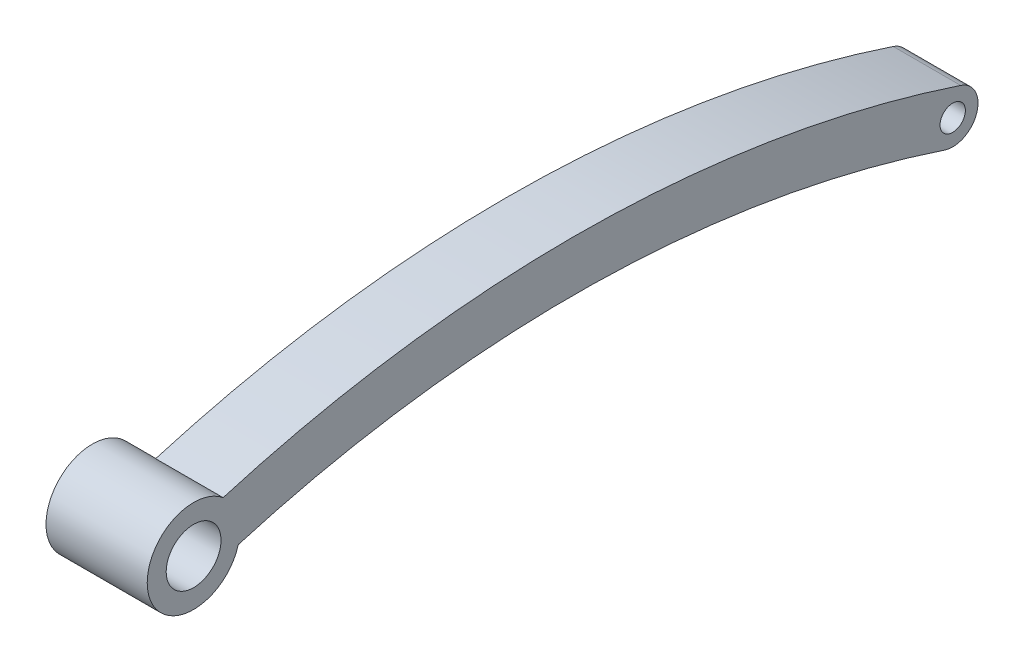
ISO-10303-21;
HEADER;
FILE_DESCRIPTION(('STEP AP214'),'2;1');
FILE_NAME('part.step','',(''),(''),'','','');
FILE_SCHEMA(('AUTOMOTIVE_DESIGN { 1 0 10303 214 1 1 1 1 }'));
ENDSEC;
DATA;
#1=APPLICATION_CONTEXT('core data for automotive mechanical design processes');
#2=APPLICATION_PROTOCOL_DEFINITION('international standard','automotive_design',2000,#1);
#3=PRODUCT_CONTEXT('',#1,'mechanical');
#4=PRODUCT('Part','Part','',(#3));
#5=PRODUCT_RELATED_PRODUCT_CATEGORY('part','',(#4));
#6=PRODUCT_DEFINITION_FORMATION('','',#4);
#7=PRODUCT_DEFINITION_CONTEXT('part definition',#1,'design');
#8=PRODUCT_DEFINITION('design','',#6,#7);
#9=PRODUCT_DEFINITION_SHAPE('','',#8);
#10=(LENGTH_UNIT() NAMED_UNIT(*) SI_UNIT(.MILLI.,.METRE.));
#11=(NAMED_UNIT(*) PLANE_ANGLE_UNIT() SI_UNIT($,.RADIAN.));
#12=(NAMED_UNIT(*) SI_UNIT($,.STERADIAN.) SOLID_ANGLE_UNIT());
#13=UNCERTAINTY_MEASURE_WITH_UNIT(LENGTH_MEASURE(1.E-05),#10,'distance_accuracy_value','');
#14=(GEOMETRIC_REPRESENTATION_CONTEXT(3) GLOBAL_UNCERTAINTY_ASSIGNED_CONTEXT((#13)) GLOBAL_UNIT_ASSIGNED_CONTEXT((#10,
#11,#12)) REPRESENTATION_CONTEXT('',''));
#15=CARTESIAN_POINT('',(0.,0.,0.));
#16=DIRECTION('',(0.,0.,1.));
#17=DIRECTION('',(1.,0.,0.));
#18=AXIS2_PLACEMENT_3D('',#15,#16,#17);
#19=CARTESIAN_POINT('',(4.,-33.9337590019143,-33.75));
#20=DIRECTION('',(-1.,0.,0.));
#21=DIRECTION('',(0.,0.,1.));
#22=AXIS2_PLACEMENT_3D('',#19,#20,#21);
#23=PLANE('',#22);
#24=CARTESIAN_POINT('',(4.,0.,0.));
#25=DIRECTION('',(-1.,0.,0.));
#26=DIRECTION('',(0.,0.,1.));
#27=AXIS2_PLACEMENT_3D('',#24,#25,#26);
#28=CIRCLE('',#27,1.625);
#29=CARTESIAN_POINT('',(4.,0.,1.625));
#30=VERTEX_POINT('',#29);
#31=EDGE_CURVE('E113',#30,#30,#28,.T.);
#32=ORIENTED_EDGE('',*,*,#31,.T.);
#33=EDGE_LOOP('',(#32));
#34=FACE_BOUND('',#33,.T.);
#35=CARTESIAN_POINT('',(4.,-67.8675180038286,-22.5));
#36=DIRECTION('',(1.,0.,0.));
#37=DIRECTION('',(0.,0.,1.));
#38=AXIS2_PLACEMENT_3D('',#35,#36,#37);
#39=CIRCLE('',#38,73.);
#40=CARTESIAN_POINT('',(4.,1.42379408399641,-45.472027972028));
#41=VERTEX_POINT('',#40);
#42=CARTESIAN_POINT('',(4.,2.12132037920733,-1.74999995678847));
#43=VERTEX_POINT('',#42);
#44=EDGE_CURVE('E129',#41,#43,#39,.T.);
#45=ORIENTED_EDGE('',*,*,#44,.T.);
#46=CARTESIAN_POINT('',(4.,0.,0.));
#47=DIRECTION('',(-1.,0.,0.));
#48=DIRECTION('',(0.,0.,1.));
#49=AXIS2_PLACEMENT_3D('',#46,#47,#48);
#50=CIRCLE('',#49,2.75);
#51=CARTESIAN_POINT('',(4.,-0.74148697723711,-2.64814974323352));
#52=VERTEX_POINT('',#51);
#53=EDGE_CURVE('E89',#52,#43,#50,.T.);
#54=ORIENTED_EDGE('',*,*,#53,.F.);
#55=CARTESIAN_POINT('',(4.,-67.8675180038286,-22.5));
#56=DIRECTION('',(-1.,0.,0.));
#57=DIRECTION('',(0.,0.,1.));
#58=AXIS2_PLACEMENT_3D('',#55,#56,#57);
#59=CIRCLE('',#58,70.);
#60=CARTESIAN_POINT('',(4.,-1.42379408399639,-44.527972027972));
#61=VERTEX_POINT('',#60);
#62=EDGE_CURVE('E64',#52,#61,#59,.T.);
#63=ORIENTED_EDGE('',*,*,#62,.T.);
#64=CARTESIAN_POINT('',(4.,0.,-45.));
#65=DIRECTION('',(1.,0.,0.));
#66=DIRECTION('',(0.,0.,-1.));
#67=AXIS2_PLACEMENT_3D('',#64,#65,#66);
#68=CIRCLE('',#67,1.5);
#69=EDGE_CURVE('E135',#61,#41,#68,.T.);
#70=ORIENTED_EDGE('',*,*,#69,.T.);
#71=EDGE_LOOP('',(#45,#54,#63,#70));
#72=FACE_BOUND('',#71,.T.);
#73=CARTESIAN_POINT('',(4.,0.,-45.));
#74=DIRECTION('',(1.,0.,0.));
#75=DIRECTION('',(0.,0.,-1.));
#76=AXIS2_PLACEMENT_3D('',#73,#74,#75);
#77=CIRCLE('',#76,0.749999999999999);
#78=CARTESIAN_POINT('',(4.,0.,-45.75));
#79=VERTEX_POINT('',#78);
#80=EDGE_CURVE('E102',#79,#79,#77,.T.);
#81=ORIENTED_EDGE('',*,*,#80,.F.);
#82=EDGE_LOOP('',(#81));
#83=FACE_BOUND('',#82,.T.);
#84=ADVANCED_FACE('F41',(#34,#72,#83),#23,.F.);
#85=CARTESIAN_POINT('',(0.,-33.9337590019143,-33.75));
#86=DIRECTION('',(-1.,0.,0.));
#87=DIRECTION('',(0.,0.,1.));
#88=AXIS2_PLACEMENT_3D('',#85,#86,#87);
#89=PLANE('',#88);
#90=CARTESIAN_POINT('',(0.,0.,0.));
#91=DIRECTION('',(-1.,0.,0.));
#92=DIRECTION('',(0.,0.,1.));
#93=AXIS2_PLACEMENT_3D('',#90,#91,#92);
#94=CIRCLE('',#93,2.75);
#95=CARTESIAN_POINT('',(0.,2.12132037920733,-1.74999995678847));
#96=VERTEX_POINT('',#95);
#97=CARTESIAN_POINT('',(0.,-0.741486977237108,-2.64814974323352));
#98=VERTEX_POINT('',#97);
#99=EDGE_CURVE('E87',#96,#98,#94,.T.);
#100=ORIENTED_EDGE('',*,*,#99,.F.);
#101=CARTESIAN_POINT('',(0.,-67.8675180038286,-22.5));
#102=DIRECTION('',(1.,0.,0.));
#103=DIRECTION('',(0.,0.,1.));
#104=AXIS2_PLACEMENT_3D('',#101,#102,#103);
#105=CIRCLE('',#104,73.);
#106=CARTESIAN_POINT('',(0.,1.42379408399641,-45.472027972028));
#107=VERTEX_POINT('',#106);
#108=EDGE_CURVE('E95',#107,#96,#105,.T.);
#109=ORIENTED_EDGE('',*,*,#108,.F.);
#110=CARTESIAN_POINT('',(0.,0.,-45.));
#111=DIRECTION('',(1.,0.,0.));
#112=DIRECTION('',(0.,0.,-1.));
#113=AXIS2_PLACEMENT_3D('',#110,#111,#112);
#114=CIRCLE('',#113,1.5);
#115=CARTESIAN_POINT('',(0.,-1.42379408399639,-44.527972027972));
#116=VERTEX_POINT('',#115);
#117=EDGE_CURVE('E132',#116,#107,#114,.T.);
#118=ORIENTED_EDGE('',*,*,#117,.F.);
#119=CARTESIAN_POINT('',(0.,-67.8675180038286,-22.5));
#120=DIRECTION('',(-1.,0.,0.));
#121=DIRECTION('',(0.,0.,1.));
#122=AXIS2_PLACEMENT_3D('',#119,#120,#121);
#123=CIRCLE('',#122,70.);
#124=EDGE_CURVE('E101',#98,#116,#123,.T.);
#125=ORIENTED_EDGE('',*,*,#124,.F.);
#126=EDGE_LOOP('',(#100,#109,#118,#125));
#127=FACE_BOUND('',#126,.T.);
#128=CARTESIAN_POINT('',(0.,0.,-45.));
#129=DIRECTION('',(1.,0.,0.));
#130=DIRECTION('',(0.,0.,-1.));
#131=AXIS2_PLACEMENT_3D('',#128,#129,#130);
#132=CIRCLE('',#131,0.749999999999999);
#133=CARTESIAN_POINT('',(0.,0.,-45.75));
#134=VERTEX_POINT('',#133);
#135=EDGE_CURVE('E91',#134,#134,#132,.T.);
#136=ORIENTED_EDGE('',*,*,#135,.T.);
#137=EDGE_LOOP('',(#136));
#138=FACE_BOUND('',#137,.T.);
#139=ADVANCED_FACE('F104',(#127,#138),#89,.T.);
#140=CARTESIAN_POINT('',(4.,-67.8675180038286,-22.5));
#141=DIRECTION('',(-1.,0.,0.));
#142=DIRECTION('',(0.,0.,1.));
#143=AXIS2_PLACEMENT_3D('',#140,#141,#142);
#144=CYLINDRICAL_SURFACE('',#143,73.);
#145=ORIENTED_EDGE('',*,*,#108,.T.);
#146=DIRECTION('',(-1.,0.,0.));
#147=VECTOR('',#146,1.);
#148=CARTESIAN_POINT('',(2.,2.12132037920736,-1.74999995678844));
#149=LINE('',#148,#147);
#150=EDGE_CURVE('E57',#96,#43,#149,.F.);
#151=ORIENTED_EDGE('',*,*,#150,.T.);
#152=ORIENTED_EDGE('',*,*,#44,.F.);
#153=DIRECTION('',(-1.,0.,0.));
#154=VECTOR('',#153,1.);
#155=CARTESIAN_POINT('',(4.,1.42379408399641,-45.472027972028));
#156=LINE('',#155,#154);
#157=EDGE_CURVE('E97',#41,#107,#156,.T.);
#158=ORIENTED_EDGE('',*,*,#157,.T.);
#159=EDGE_LOOP('',(#145,#151,#152,#158));
#160=FACE_BOUND('',#159,.T.);
#161=ADVANCED_FACE('F43',(#160),#144,.T.);
#162=CARTESIAN_POINT('',(4.,-67.8675180038286,-22.5));
#163=DIRECTION('',(-1.,0.,0.));
#164=DIRECTION('',(0.,0.,1.));
#165=AXIS2_PLACEMENT_3D('',#162,#163,#164);
#166=CYLINDRICAL_SURFACE('',#165,70.);
#167=ORIENTED_EDGE('',*,*,#62,.F.);
#168=DIRECTION('',(-1.,0.,0.));
#169=VECTOR('',#168,1.);
#170=CARTESIAN_POINT('',(2.,-0.741486977237129,-2.64814974323352));
#171=LINE('',#170,#169);
#172=EDGE_CURVE('E11',#52,#98,#171,.T.);
#173=ORIENTED_EDGE('',*,*,#172,.T.);
#174=ORIENTED_EDGE('',*,*,#124,.T.);
#175=DIRECTION('',(-1.,0.,0.));
#176=VECTOR('',#175,1.);
#177=CARTESIAN_POINT('',(4.,-1.42379408399639,-44.527972027972));
#178=LINE('',#177,#176);
#179=EDGE_CURVE('E50',#61,#116,#178,.T.);
#180=ORIENTED_EDGE('',*,*,#179,.F.);
#181=EDGE_LOOP('',(#167,#173,#174,#180));
#182=FACE_BOUND('',#181,.T.);
#183=ADVANCED_FACE('F148',(#182),#166,.F.);
#184=CARTESIAN_POINT('',(4.,0.,-45.));
#185=DIRECTION('',(-1.,0.,0.));
#186=DIRECTION('',(0.,0.,1.));
#187=AXIS2_PLACEMENT_3D('',#184,#185,#186);
#188=CYLINDRICAL_SURFACE('',#187,1.5);
#189=ORIENTED_EDGE('',*,*,#117,.T.);
#190=ORIENTED_EDGE('',*,*,#157,.F.);
#191=ORIENTED_EDGE('',*,*,#69,.F.);
#192=ORIENTED_EDGE('',*,*,#179,.T.);
#193=EDGE_LOOP('',(#189,#190,#191,#192));
#194=FACE_BOUND('',#193,.T.);
#195=ADVANCED_FACE('F147',(#194),#188,.T.);
#196=CARTESIAN_POINT('',(4.,0.,-45.));
#197=DIRECTION('',(-1.,0.,0.));
#198=DIRECTION('',(0.,0.,1.));
#199=AXIS2_PLACEMENT_3D('',#196,#197,#198);
#200=CYLINDRICAL_SURFACE('',#199,0.749999999999999);
#201=ORIENTED_EDGE('',*,*,#80,.T.);
#202=EDGE_LOOP('',(#201));
#203=FACE_BOUND('',#202,.T.);
#204=ORIENTED_EDGE('',*,*,#135,.F.);
#205=EDGE_LOOP('',(#204));
#206=FACE_BOUND('',#205,.T.);
#207=ADVANCED_FACE('F156',(#203,#206),#200,.F.);
#208=CARTESIAN_POINT('',(4.,0.,0.));
#209=DIRECTION('',(-1.,0.,0.));
#210=DIRECTION('',(0.,0.,1.));
#211=AXIS2_PLACEMENT_3D('',#208,#209,#210);
#212=CYLINDRICAL_SURFACE('',#211,2.75);
#213=ORIENTED_EDGE('',*,*,#150,.F.);
#214=ORIENTED_EDGE('',*,*,#99,.T.);
#215=ORIENTED_EDGE('',*,*,#172,.F.);
#216=ORIENTED_EDGE('',*,*,#53,.T.);
#217=EDGE_LOOP('',(#213,#214,#215,#216));
#218=FACE_BOUND('',#217,.T.);
#219=CARTESIAN_POINT('',(-2.,0.,0.));
#220=DIRECTION('',(-1.,0.,0.));
#221=DIRECTION('',(0.,0.,1.));
#222=AXIS2_PLACEMENT_3D('',#219,#220,#221);
#223=CIRCLE('',#222,2.75);
#224=CARTESIAN_POINT('',(-2.,0.,2.75));
#225=VERTEX_POINT('',#224);
#226=EDGE_CURVE('E107',#225,#225,#223,.T.);
#227=ORIENTED_EDGE('',*,*,#226,.F.);
#228=EDGE_LOOP('',(#227));
#229=FACE_BOUND('',#228,.T.);
#230=ADVANCED_FACE('F84',(#218,#229),#212,.T.);
#231=CARTESIAN_POINT('',(4.,0.,0.));
#232=DIRECTION('',(-1.,0.,0.));
#233=DIRECTION('',(0.,0.,1.));
#234=AXIS2_PLACEMENT_3D('',#231,#232,#233);
#235=CYLINDRICAL_SURFACE('',#234,1.625);
#236=ORIENTED_EDGE('',*,*,#31,.F.);
#237=EDGE_LOOP('',(#236));
#238=FACE_BOUND('',#237,.T.);
#239=CARTESIAN_POINT('',(-2.,0.,0.));
#240=DIRECTION('',(-1.,0.,0.));
#241=DIRECTION('',(0.,0.,1.));
#242=AXIS2_PLACEMENT_3D('',#239,#240,#241);
#243=CIRCLE('',#242,1.625);
#244=CARTESIAN_POINT('',(-2.,0.,1.625));
#245=VERTEX_POINT('',#244);
#246=EDGE_CURVE('E108',#245,#245,#243,.T.);
#247=ORIENTED_EDGE('',*,*,#246,.T.);
#248=EDGE_LOOP('',(#247));
#249=FACE_BOUND('',#248,.T.);
#250=ADVANCED_FACE('F179',(#238,#249),#235,.F.);
#251=CARTESIAN_POINT('',(-2.,0.,0.));
#252=DIRECTION('',(-1.,0.,0.));
#253=DIRECTION('',(0.,0.,1.));
#254=AXIS2_PLACEMENT_3D('',#251,#252,#253);
#255=PLANE('',#254);
#256=ORIENTED_EDGE('',*,*,#226,.T.);
#257=EDGE_LOOP('',(#256));
#258=FACE_BOUND('',#257,.T.);
#259=ORIENTED_EDGE('',*,*,#246,.F.);
#260=EDGE_LOOP('',(#259));
#261=FACE_BOUND('',#260,.T.);
#262=ADVANCED_FACE('F188',(#258,#261),#255,.T.);
#263=CLOSED_SHELL('',(#84,#139,#161,#183,#195,#207,#230,#250,#262));
#264=MANIFOLD_SOLID_BREP('B2',#263);
#265=ADVANCED_BREP_SHAPE_REPRESENTATION('',(#18,#264),#14);
#266=SHAPE_DEFINITION_REPRESENTATION(#9,#265);
ENDSEC;
END-ISO-10303-21;
